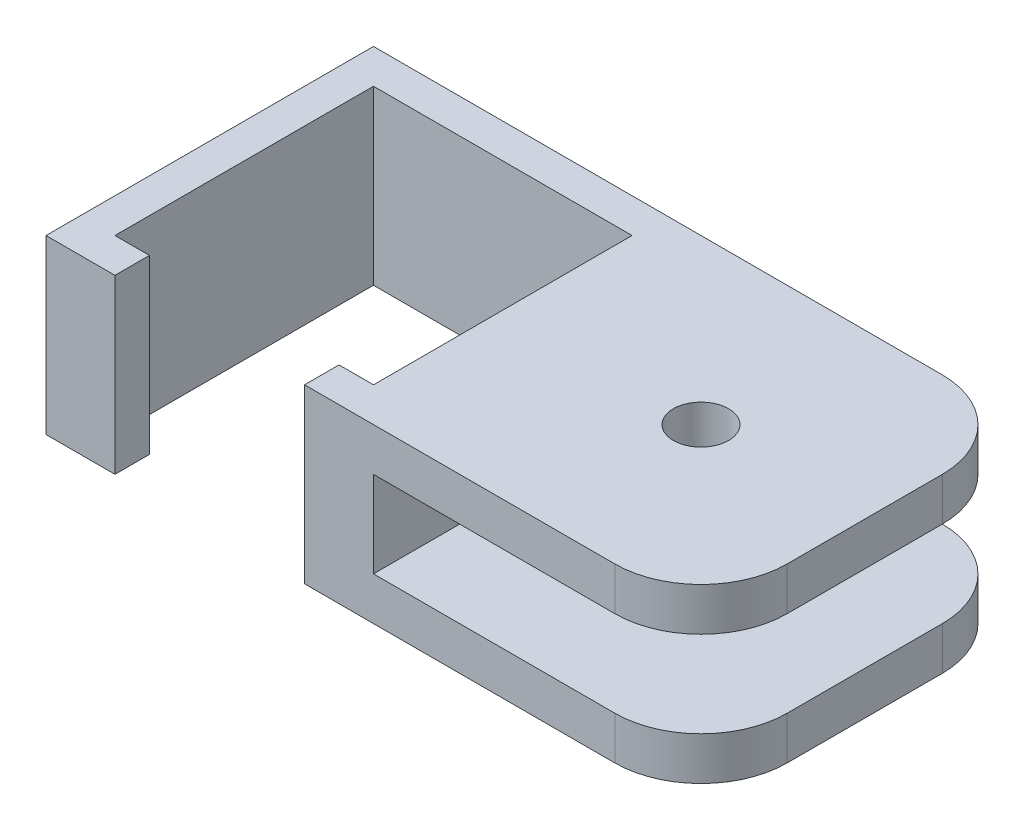
ISO-10303-21;
HEADER;
FILE_DESCRIPTION(('STEP AP214'),'2;1');
FILE_NAME('part.step','',(''),(''),'','','');
FILE_SCHEMA(('AUTOMOTIVE_DESIGN { 1 0 10303 214 1 1 1 1 }'));
ENDSEC;
DATA;
#1=APPLICATION_CONTEXT('core data for automotive mechanical design processes');
#2=APPLICATION_PROTOCOL_DEFINITION('international standard','automotive_design',2000,#1);
#3=PRODUCT_CONTEXT('',#1,'mechanical');
#4=PRODUCT('Part','Part','',(#3));
#5=PRODUCT_RELATED_PRODUCT_CATEGORY('part','',(#4));
#6=PRODUCT_DEFINITION_FORMATION('','',#4);
#7=PRODUCT_DEFINITION_CONTEXT('part definition',#1,'design');
#8=PRODUCT_DEFINITION('design','',#6,#7);
#9=PRODUCT_DEFINITION_SHAPE('','',#8);
#10=(LENGTH_UNIT() NAMED_UNIT(*) SI_UNIT(.MILLI.,.METRE.));
#11=(NAMED_UNIT(*) PLANE_ANGLE_UNIT() SI_UNIT($,.RADIAN.));
#12=(NAMED_UNIT(*) SI_UNIT($,.STERADIAN.) SOLID_ANGLE_UNIT());
#13=UNCERTAINTY_MEASURE_WITH_UNIT(LENGTH_MEASURE(1.E-05),#10,'distance_accuracy_value','');
#14=(GEOMETRIC_REPRESENTATION_CONTEXT(3) GLOBAL_UNCERTAINTY_ASSIGNED_CONTEXT((#13)) GLOBAL_UNIT_ASSIGNED_CONTEXT((#10,
#11,#12)) REPRESENTATION_CONTEXT('',''));
#15=CARTESIAN_POINT('',(0.,0.,0.));
#16=DIRECTION('',(0.,0.,1.));
#17=DIRECTION('',(1.,0.,0.));
#18=AXIS2_PLACEMENT_3D('',#15,#16,#17);
#19=CARTESIAN_POINT('',(28.5955882352941,0.,0.));
#20=DIRECTION('',(-1.,0.,0.));
#21=DIRECTION('',(0.,0.,1.));
#22=AXIS2_PLACEMENT_3D('',#19,#20,#21);
#23=PLANE('',#22);
#24=DIRECTION('',(0.,0.,-1.));
#25=VECTOR('',#24,1.);
#26=CARTESIAN_POINT('',(28.5955882352941,2.5,-8.32720588235292));
#27=LINE('',#26,#25);
#28=CARTESIAN_POINT('',(28.5955882352941,2.5,5.67279411764708));
#29=VERTEX_POINT('',#28);
#30=CARTESIAN_POINT('',(28.5955882352941,2.5,-3.32720588235292));
#31=VERTEX_POINT('',#30);
#32=EDGE_CURVE('E202',#29,#31,#27,.T.);
#33=ORIENTED_EDGE('',*,*,#32,.F.);
#34=DIRECTION('',(0.,-1.,0.));
#35=VECTOR('',#34,1.);
#36=CARTESIAN_POINT('',(28.5955882352941,19.,5.67279411764708));
#37=LINE('',#36,#35);
#38=CARTESIAN_POINT('',(28.5955882352941,0.,5.67279411764705));
#39=VERTEX_POINT('',#38);
#40=EDGE_CURVE('E11',#39,#29,#37,.F.);
#41=ORIENTED_EDGE('',*,*,#40,.F.);
#42=DIRECTION('',(0.,0.,-1.));
#43=VECTOR('',#42,1.);
#44=CARTESIAN_POINT('',(28.5955882352941,0.,10.6727941176471));
#45=LINE('',#44,#43);
#46=CARTESIAN_POINT('',(28.5955882352941,0.,-3.32720588235288));
#47=VERTEX_POINT('',#46);
#48=EDGE_CURVE('E268',#39,#47,#45,.T.);
#49=ORIENTED_EDGE('',*,*,#48,.T.);
#50=DIRECTION('',(0.,-1.,0.));
#51=VECTOR('',#50,1.);
#52=CARTESIAN_POINT('',(28.5955882352941,19.,-3.32720588235292));
#53=LINE('',#52,#51);
#54=EDGE_CURVE('E48',#47,#31,#53,.F.);
#55=ORIENTED_EDGE('',*,*,#54,.T.);
#56=EDGE_LOOP('',(#33,#41,#49,#55));
#57=FACE_BOUND('',#56,.T.);
#58=ADVANCED_FACE('F38',(#57),#23,.F.);
#59=CARTESIAN_POINT('',(23.5955882352941,19.,-3.32720588235292));
#60=DIRECTION('',(0.,-1.,0.));
#61=DIRECTION('',(0.,0.,-1.));
#62=AXIS2_PLACEMENT_3D('',#59,#60,#61);
#63=CYLINDRICAL_SURFACE('',#62,5.);
#64=CARTESIAN_POINT('',(23.5955882352941,2.5,-3.32720588235292));
#65=DIRECTION('',(0.,1.,0.));
#66=DIRECTION('',(0.,0.,1.));
#67=AXIS2_PLACEMENT_3D('',#64,#65,#66);
#68=CIRCLE('',#67,5.);
#69=CARTESIAN_POINT('',(23.5955882352941,2.5,-8.32720588235292));
#70=VERTEX_POINT('',#69);
#71=EDGE_CURVE('E212',#31,#70,#68,.T.);
#72=ORIENTED_EDGE('',*,*,#71,.F.);
#73=ORIENTED_EDGE('',*,*,#54,.F.);
#74=CARTESIAN_POINT('',(23.5955882352941,0.,-3.32720588235292));
#75=DIRECTION('',(0.,1.,0.));
#76=DIRECTION('',(0.,0.,1.));
#77=AXIS2_PLACEMENT_3D('',#74,#75,#76);
#78=CIRCLE('',#77,5.);
#79=CARTESIAN_POINT('',(23.5955882352941,0.,-8.32720588235292));
#80=VERTEX_POINT('',#79);
#81=EDGE_CURVE('E232',#47,#80,#78,.T.);
#82=ORIENTED_EDGE('',*,*,#81,.T.);
#83=DIRECTION('',(0.,-1.,0.));
#84=VECTOR('',#83,1.);
#85=CARTESIAN_POINT('',(23.5955882352941,19.,-8.32720588235292));
#86=LINE('',#85,#84);
#87=EDGE_CURVE('E252',#70,#80,#86,.T.);
#88=ORIENTED_EDGE('',*,*,#87,.F.);
#89=EDGE_LOOP('',(#72,#73,#82,#88));
#90=FACE_BOUND('',#89,.T.);
#91=ADVANCED_FACE('F417',(#90),#63,.T.);
#92=CARTESIAN_POINT('',(23.5955882352941,19.,5.67279411764708));
#93=DIRECTION('',(0.,-1.,0.));
#94=DIRECTION('',(0.,0.,-1.));
#95=AXIS2_PLACEMENT_3D('',#92,#93,#94);
#96=CYLINDRICAL_SURFACE('',#95,5.);
#97=CARTESIAN_POINT('',(23.5955882352941,2.5,5.67279411764708));
#98=DIRECTION('',(0.,1.,0.));
#99=DIRECTION('',(0.,0.,1.));
#100=AXIS2_PLACEMENT_3D('',#97,#98,#99);
#101=CIRCLE('',#100,5.);
#102=CARTESIAN_POINT('',(23.5955882352941,2.5,10.6727941176471));
#103=VERTEX_POINT('',#102);
#104=EDGE_CURVE('E209',#103,#29,#101,.T.);
#105=ORIENTED_EDGE('',*,*,#104,.F.);
#106=DIRECTION('',(0.,-1.,0.));
#107=VECTOR('',#106,1.);
#108=CARTESIAN_POINT('',(23.5955882352941,19.,10.6727941176471));
#109=LINE('',#108,#107);
#110=CARTESIAN_POINT('',(23.5955882352941,0.,10.6727941176471));
#111=VERTEX_POINT('',#110);
#112=EDGE_CURVE('E200',#103,#111,#109,.T.);
#113=ORIENTED_EDGE('',*,*,#112,.T.);
#114=CARTESIAN_POINT('',(23.5955882352941,0.,5.67279411764708));
#115=DIRECTION('',(0.,1.,0.));
#116=DIRECTION('',(0.,0.,1.));
#117=AXIS2_PLACEMENT_3D('',#114,#115,#116);
#118=CIRCLE('',#117,5.);
#119=EDGE_CURVE('E239',#111,#39,#118,.T.);
#120=ORIENTED_EDGE('',*,*,#119,.T.);
#121=ORIENTED_EDGE('',*,*,#40,.T.);
#122=EDGE_LOOP('',(#105,#113,#120,#121));
#123=FACE_BOUND('',#122,.T.);
#124=ADVANCED_FACE('F411',(#123),#96,.T.);
#125=CARTESIAN_POINT('',(19.0955882352941,19.,1.17279411764708));
#126=DIRECTION('',(0.,-1.,0.));
#127=DIRECTION('',(0.,0.,-1.));
#128=AXIS2_PLACEMENT_3D('',#125,#126,#127);
#129=CYLINDRICAL_SURFACE('',#128,1.6);
#130=CARTESIAN_POINT('',(19.0955882352941,0.,1.17279411764708));
#131=DIRECTION('',(0.,-1.,0.));
#132=DIRECTION('',(0.,0.,-1.));
#133=AXIS2_PLACEMENT_3D('',#130,#131,#132);
#134=CIRCLE('',#133,1.6);
#135=CARTESIAN_POINT('',(19.0955882352941,0.,-0.427205882352919));
#136=VERTEX_POINT('',#135);
#137=EDGE_CURVE('E233',#136,#136,#134,.T.);
#138=ORIENTED_EDGE('',*,*,#137,.T.);
#139=EDGE_LOOP('',(#138));
#140=FACE_BOUND('',#139,.T.);
#141=CARTESIAN_POINT('',(19.0955882352941,2.5,1.17279411764708));
#142=DIRECTION('',(0.,1.,0.));
#143=DIRECTION('',(0.,0.,1.));
#144=AXIS2_PLACEMENT_3D('',#141,#142,#143);
#145=CIRCLE('',#144,1.6);
#146=CARTESIAN_POINT('',(19.0955882352941,2.5,2.77279411764708));
#147=VERTEX_POINT('',#146);
#148=EDGE_CURVE('E42',#147,#147,#145,.F.);
#149=ORIENTED_EDGE('',*,*,#148,.F.);
#150=EDGE_LOOP('',(#149));
#151=FACE_BOUND('',#150,.T.);
#152=ADVANCED_FACE('F400',(#140,#151),#129,.F.);
#153=CARTESIAN_POINT('',(28.5955882352941,0.,0.));
#154=DIRECTION('',(1.,0.,0.));
#155=DIRECTION('',(0.,0.,-1.));
#156=AXIS2_PLACEMENT_3D('',#153,#154,#155);
#157=PLANE('',#156);
#158=DIRECTION('',(0.,-1.,0.));
#159=VECTOR('',#158,1.);
#160=CARTESIAN_POINT('',(28.5955882352941,19.,5.67279411764705));
#161=LINE('',#160,#159);
#162=CARTESIAN_POINT('',(28.5955882352941,10.,5.67279411764705));
#163=VERTEX_POINT('',#162);
#164=CARTESIAN_POINT('',(28.5955882352941,7.5,5.67279411764705));
#165=VERTEX_POINT('',#164);
#166=EDGE_CURVE('E242',#163,#165,#161,.T.);
#167=ORIENTED_EDGE('',*,*,#166,.T.);
#168=DIRECTION('',(0.,0.,1.));
#169=VECTOR('',#168,1.);
#170=CARTESIAN_POINT('',(28.5955882352941,7.5,10.6727941176471));
#171=LINE('',#170,#169);
#172=CARTESIAN_POINT('',(28.5955882352941,7.5,-3.32720588235292));
#173=VERTEX_POINT('',#172);
#174=EDGE_CURVE('E64',#173,#165,#171,.T.);
#175=ORIENTED_EDGE('',*,*,#174,.F.);
#176=DIRECTION('',(0.,-1.,0.));
#177=VECTOR('',#176,1.);
#178=CARTESIAN_POINT('',(28.5955882352941,19.,-3.32720588235288));
#179=LINE('',#178,#177);
#180=CARTESIAN_POINT('',(28.5955882352941,10.,-3.32720588235292));
#181=VERTEX_POINT('',#180);
#182=EDGE_CURVE('E243',#181,#173,#179,.T.);
#183=ORIENTED_EDGE('',*,*,#182,.F.);
#184=DIRECTION('',(0.,0.,1.));
#185=VECTOR('',#184,1.);
#186=CARTESIAN_POINT('',(28.5955882352941,10.,10.6727941176471));
#187=LINE('',#186,#185);
#188=EDGE_CURVE('E272',#181,#163,#187,.T.);
#189=ORIENTED_EDGE('',*,*,#188,.T.);
#190=EDGE_LOOP('',(#167,#175,#183,#189));
#191=FACE_BOUND('',#190,.T.);
#192=ADVANCED_FACE('F414',(#191),#157,.T.);
#193=CARTESIAN_POINT('',(23.5955882352941,7.5,-3.32720588235292));
#194=DIRECTION('',(0.,-1.,0.));
#195=DIRECTION('',(0.,0.,-1.));
#196=AXIS2_PLACEMENT_3D('',#193,#194,#195);
#197=CIRCLE('',#196,5.);
#198=CARTESIAN_POINT('',(23.5955882352941,7.5,-8.32720588235292));
#199=VERTEX_POINT('',#198);
#200=EDGE_CURVE('E229',#199,#173,#197,.T.);
#201=ORIENTED_EDGE('',*,*,#200,.F.);
#202=CARTESIAN_POINT('',(23.5955882352941,10.,-8.32720588235292));
#203=VERTEX_POINT('',#202);
#204=EDGE_CURVE('E256',#203,#199,#86,.T.);
#205=ORIENTED_EDGE('',*,*,#204,.F.);
#206=CARTESIAN_POINT('',(23.5955882352941,10.,-3.32720588235292));
#207=DIRECTION('',(0.,1.,0.));
#208=DIRECTION('',(0.,0.,1.));
#209=AXIS2_PLACEMENT_3D('',#206,#207,#208);
#210=CIRCLE('',#209,5.);
#211=EDGE_CURVE('E237',#203,#181,#210,.F.);
#212=ORIENTED_EDGE('',*,*,#211,.T.);
#213=ORIENTED_EDGE('',*,*,#182,.T.);
#214=EDGE_LOOP('',(#201,#205,#212,#213));
#215=FACE_BOUND('',#214,.T.);
#216=ADVANCED_FACE('F408',(#215),#63,.T.);
#217=CARTESIAN_POINT('',(23.5955882352941,7.5,5.67279411764708));
#218=DIRECTION('',(0.,-1.,0.));
#219=DIRECTION('',(0.,0.,-1.));
#220=AXIS2_PLACEMENT_3D('',#217,#218,#219);
#221=CIRCLE('',#220,5.);
#222=CARTESIAN_POINT('',(23.5955882352941,7.5,10.6727941176471));
#223=VERTEX_POINT('',#222);
#224=EDGE_CURVE('E226',#165,#223,#221,.T.);
#225=ORIENTED_EDGE('',*,*,#224,.F.);
#226=ORIENTED_EDGE('',*,*,#166,.F.);
#227=CARTESIAN_POINT('',(23.5955882352941,10.,5.67279411764708));
#228=DIRECTION('',(0.,1.,0.));
#229=DIRECTION('',(0.,0.,1.));
#230=AXIS2_PLACEMENT_3D('',#227,#228,#229);
#231=CIRCLE('',#230,5.);
#232=CARTESIAN_POINT('',(23.5955882352941,10.,10.6727941176471));
#233=VERTEX_POINT('',#232);
#234=EDGE_CURVE('E261',#163,#233,#231,.F.);
#235=ORIENTED_EDGE('',*,*,#234,.T.);
#236=EDGE_CURVE('E238',#233,#223,#109,.T.);
#237=ORIENTED_EDGE('',*,*,#236,.T.);
#238=EDGE_LOOP('',(#225,#226,#235,#237));
#239=FACE_BOUND('',#238,.T.);
#240=ADVANCED_FACE('F397',(#239),#96,.T.);
#241=CARTESIAN_POINT('',(19.0955882352941,10.,1.17279411764708));
#242=DIRECTION('',(0.,1.,0.));
#243=DIRECTION('',(0.,0.,1.));
#244=AXIS2_PLACEMENT_3D('',#241,#242,#243);
#245=CIRCLE('',#244,1.6);
#246=CARTESIAN_POINT('',(19.0955882352941,10.,2.77279411764708));
#247=VERTEX_POINT('',#246);
#248=EDGE_CURVE('E264',#247,#247,#245,.T.);
#249=ORIENTED_EDGE('',*,*,#248,.T.);
#250=EDGE_LOOP('',(#249));
#251=FACE_BOUND('',#250,.T.);
#252=CARTESIAN_POINT('',(19.0955882352941,7.5,1.17279411764708));
#253=DIRECTION('',(0.,-1.,0.));
#254=DIRECTION('',(0.,0.,-1.));
#255=AXIS2_PLACEMENT_3D('',#252,#253,#254);
#256=CIRCLE('',#255,1.6);
#257=CARTESIAN_POINT('',(19.0955882352941,7.5,-0.427205882352919));
#258=VERTEX_POINT('',#257);
#259=EDGE_CURVE('E225',#258,#258,#256,.F.);
#260=ORIENTED_EDGE('',*,*,#259,.F.);
#261=EDGE_LOOP('',(#260));
#262=FACE_BOUND('',#261,.T.);
#263=ADVANCED_FACE('F394',(#251,#262),#129,.F.);
#264=CARTESIAN_POINT('',(-9.40441176470588,10.,-8.32720588235292));
#265=DIRECTION('',(0.,0.,1.));
#266=DIRECTION('',(1.,0.,0.));
#267=AXIS2_PLACEMENT_3D('',#264,#265,#266);
#268=PLANE('',#267);
#269=DIRECTION('',(0.,-1.,0.));
#270=VECTOR('',#269,1.);
#271=CARTESIAN_POINT('',(9.59558823529411,10.,-8.32720588235292));
#272=LINE('',#271,#270);
#273=CARTESIAN_POINT('',(9.59558823529412,7.5,-8.32720588235292));
#274=VERTEX_POINT('',#273);
#275=CARTESIAN_POINT('',(9.59558823529411,2.5,-8.32720588235292));
#276=VERTEX_POINT('',#275);
#277=EDGE_CURVE('E189',#274,#276,#272,.T.);
#278=ORIENTED_EDGE('',*,*,#277,.T.);
#279=DIRECTION('',(-1.,0.,0.));
#280=VECTOR('',#279,1.);
#281=CARTESIAN_POINT('',(9.59558823529411,2.5,-8.32720588235292));
#282=LINE('',#281,#280);
#283=EDGE_CURVE('E194',#70,#276,#282,.T.);
#284=ORIENTED_EDGE('',*,*,#283,.F.);
#285=ORIENTED_EDGE('',*,*,#87,.T.);
#286=DIRECTION('',(-1.,0.,0.));
#287=VECTOR('',#286,1.);
#288=CARTESIAN_POINT('',(-9.40441176470588,0.,-8.32720588235292));
#289=LINE('',#288,#287);
#290=CARTESIAN_POINT('',(-9.40441176470588,0.,-8.32720588235292));
#291=VERTEX_POINT('',#290);
#292=EDGE_CURVE('E332',#80,#291,#289,.T.);
#293=ORIENTED_EDGE('',*,*,#292,.T.);
#294=DIRECTION('',(0.,-1.,0.));
#295=VECTOR('',#294,1.);
#296=CARTESIAN_POINT('',(-9.40441176470588,10.,-8.32720588235292));
#297=LINE('',#296,#295);
#298=CARTESIAN_POINT('',(-9.40441176470588,10.,-8.32720588235292));
#299=VERTEX_POINT('',#298);
#300=EDGE_CURVE('E361',#299,#291,#297,.T.);
#301=ORIENTED_EDGE('',*,*,#300,.F.);
#302=DIRECTION('',(-1.,0.,0.));
#303=VECTOR('',#302,1.);
#304=CARTESIAN_POINT('',(-9.40441176470588,10.,-8.32720588235292));
#305=LINE('',#304,#303);
#306=EDGE_CURVE('E298',#203,#299,#305,.T.);
#307=ORIENTED_EDGE('',*,*,#306,.F.);
#308=ORIENTED_EDGE('',*,*,#204,.T.);
#309=DIRECTION('',(1.,0.,0.));
#310=VECTOR('',#309,1.);
#311=CARTESIAN_POINT('',(9.59558823529412,7.5,-8.32720588235292));
#312=LINE('',#311,#310);
#313=EDGE_CURVE('E217',#274,#199,#312,.T.);
#314=ORIENTED_EDGE('',*,*,#313,.F.);
#315=EDGE_LOOP('',(#278,#284,#285,#293,#301,#307,#308,#314));
#316=FACE_BOUND('',#315,.T.);
#317=ADVANCED_FACE('F396',(#316),#268,.F.);
#318=CARTESIAN_POINT('',(9.59558823529411,10.,-8.32720588235292));
#319=DIRECTION('',(-1.,0.,0.));
#320=DIRECTION('',(0.,0.,1.));
#321=AXIS2_PLACEMENT_3D('',#318,#319,#320);
#322=PLANE('',#321);
#323=DIRECTION('',(0.,-1.,0.));
#324=VECTOR('',#323,1.);
#325=CARTESIAN_POINT('',(9.59558823529412,10.,10.6727941176471));
#326=LINE('',#325,#324);
#327=CARTESIAN_POINT('',(9.59558823529412,7.5,10.6727941176471));
#328=VERTEX_POINT('',#327);
#329=CARTESIAN_POINT('',(9.59558823529412,2.5,10.6727941176471));
#330=VERTEX_POINT('',#329);
#331=EDGE_CURVE('E179',#328,#330,#326,.T.);
#332=ORIENTED_EDGE('',*,*,#331,.T.);
#333=DIRECTION('',(0.,0.,1.));
#334=VECTOR('',#333,1.);
#335=CARTESIAN_POINT('',(9.59558823529411,2.5,-8.32720588235292));
#336=LINE('',#335,#334);
#337=EDGE_CURVE('E181',#276,#330,#336,.T.);
#338=ORIENTED_EDGE('',*,*,#337,.F.);
#339=ORIENTED_EDGE('',*,*,#277,.F.);
#340=DIRECTION('',(0.,0.,-1.));
#341=VECTOR('',#340,1.);
#342=CARTESIAN_POINT('',(9.59558823529412,7.5,10.6727941176471));
#343=LINE('',#342,#341);
#344=EDGE_CURVE('E183',#328,#274,#343,.T.);
#345=ORIENTED_EDGE('',*,*,#344,.F.);
#346=EDGE_LOOP('',(#332,#338,#339,#345));
#347=FACE_BOUND('',#346,.T.);
#348=ADVANCED_FACE('F180',(#347),#322,.F.);
#349=CARTESIAN_POINT('',(-7.40441176470588,10.,-6.32720588235292));
#350=DIRECTION('',(-1.,0.,0.));
#351=DIRECTION('',(0.,0.,1.));
#352=AXIS2_PLACEMENT_3D('',#349,#350,#351);
#353=PLANE('',#352);
#354=DIRECTION('',(0.,0.,-1.));
#355=VECTOR('',#354,1.);
#356=CARTESIAN_POINT('',(-7.40441176470588,0.,-6.32720588235292));
#357=LINE('',#356,#355);
#358=CARTESIAN_POINT('',(-7.40441176470588,0.,8.67279411764708));
#359=VERTEX_POINT('',#358);
#360=CARTESIAN_POINT('',(-7.40441176470588,0.,-6.32720588235292));
#361=VERTEX_POINT('',#360);
#362=EDGE_CURVE('E276',#359,#361,#357,.T.);
#363=ORIENTED_EDGE('',*,*,#362,.T.);
#364=DIRECTION('',(0.,-1.,0.));
#365=VECTOR('',#364,1.);
#366=CARTESIAN_POINT('',(-7.40441176470588,10.,-6.32720588235292));
#367=LINE('',#366,#365);
#368=CARTESIAN_POINT('',(-7.40441176470588,10.,-6.32720588235292));
#369=VERTEX_POINT('',#368);
#370=EDGE_CURVE('E382',#369,#361,#367,.T.);
#371=ORIENTED_EDGE('',*,*,#370,.F.);
#372=DIRECTION('',(0.,0.,-1.));
#373=VECTOR('',#372,1.);
#374=CARTESIAN_POINT('',(-7.40441176470588,10.,-6.32720588235292));
#375=LINE('',#374,#373);
#376=CARTESIAN_POINT('',(-7.40441176470588,10.,8.67279411764708));
#377=VERTEX_POINT('',#376);
#378=EDGE_CURVE('E277',#377,#369,#375,.T.);
#379=ORIENTED_EDGE('',*,*,#378,.F.);
#380=DIRECTION('',(0.,-1.,0.));
#381=VECTOR('',#380,1.);
#382=CARTESIAN_POINT('',(-7.40441176470588,10.,8.67279411764708));
#383=LINE('',#382,#381);
#384=EDGE_CURVE('E313',#377,#359,#383,.T.);
#385=ORIENTED_EDGE('',*,*,#384,.T.);
#386=EDGE_LOOP('',(#363,#371,#379,#385));
#387=FACE_BOUND('',#386,.T.);
#388=ADVANCED_FACE('F40',(#387),#353,.F.);
#389=CARTESIAN_POINT('',(-7.40441176470588,10.,-6.32720588235292));
#390=DIRECTION('',(0.,0.,-1.));
#391=DIRECTION('',(-1.,0.,0.));
#392=AXIS2_PLACEMENT_3D('',#389,#390,#391);
#393=PLANE('',#392);
#394=DIRECTION('',(1.,0.,0.));
#395=VECTOR('',#394,1.);
#396=CARTESIAN_POINT('',(-7.40441176470588,0.,-6.32720588235292));
#397=LINE('',#396,#395);
#398=CARTESIAN_POINT('',(7.59558823529412,0.,-6.32720588235291));
#399=VERTEX_POINT('',#398);
#400=EDGE_CURVE('E317',#361,#399,#397,.T.);
#401=ORIENTED_EDGE('',*,*,#400,.T.);
#402=DIRECTION('',(0.,-1.,0.));
#403=VECTOR('',#402,1.);
#404=CARTESIAN_POINT('',(7.59558823529412,10.,-6.32720588235291));
#405=LINE('',#404,#403);
#406=CARTESIAN_POINT('',(7.59558823529412,10.,-6.32720588235291));
#407=VERTEX_POINT('',#406);
#408=EDGE_CURVE('E378',#407,#399,#405,.T.);
#409=ORIENTED_EDGE('',*,*,#408,.F.);
#410=DIRECTION('',(1.,0.,0.));
#411=VECTOR('',#410,1.);
#412=CARTESIAN_POINT('',(-7.40441176470588,10.,-6.32720588235292));
#413=LINE('',#412,#411);
#414=EDGE_CURVE('E281',#369,#407,#413,.T.);
#415=ORIENTED_EDGE('',*,*,#414,.F.);
#416=ORIENTED_EDGE('',*,*,#370,.T.);
#417=EDGE_LOOP('',(#401,#409,#415,#416));
#418=FACE_BOUND('',#417,.T.);
#419=ADVANCED_FACE('F468',(#418),#393,.F.);
#420=CARTESIAN_POINT('',(7.59558823529412,10.,-6.32720588235291));
#421=DIRECTION('',(1.,0.,0.));
#422=DIRECTION('',(0.,0.,-1.));
#423=AXIS2_PLACEMENT_3D('',#420,#421,#422);
#424=PLANE('',#423);
#425=DIRECTION('',(0.,0.,1.));
#426=VECTOR('',#425,1.);
#427=CARTESIAN_POINT('',(7.59558823529412,0.,-6.32720588235291));
#428=LINE('',#427,#426);
#429=CARTESIAN_POINT('',(7.59558823529412,0.,8.67279411764708));
#430=VERTEX_POINT('',#429);
#431=EDGE_CURVE('E320',#399,#430,#428,.T.);
#432=ORIENTED_EDGE('',*,*,#431,.T.);
#433=DIRECTION('',(0.,-1.,0.));
#434=VECTOR('',#433,1.);
#435=CARTESIAN_POINT('',(7.59558823529412,10.,8.67279411764708));
#436=LINE('',#435,#434);
#437=CARTESIAN_POINT('',(7.59558823529412,10.,8.67279411764708));
#438=VERTEX_POINT('',#437);
#439=EDGE_CURVE('E374',#438,#430,#436,.T.);
#440=ORIENTED_EDGE('',*,*,#439,.F.);
#441=DIRECTION('',(0.,0.,1.));
#442=VECTOR('',#441,1.);
#443=CARTESIAN_POINT('',(7.59558823529412,10.,-6.32720588235291));
#444=LINE('',#443,#442);
#445=EDGE_CURVE('E285',#407,#438,#444,.T.);
#446=ORIENTED_EDGE('',*,*,#445,.F.);
#447=ORIENTED_EDGE('',*,*,#408,.T.);
#448=EDGE_LOOP('',(#432,#440,#446,#447));
#449=FACE_BOUND('',#448,.T.);
#450=ADVANCED_FACE('F465',(#449),#424,.F.);
#451=CARTESIAN_POINT('',(5.59558823529412,10.,8.67279411764708));
#452=DIRECTION('',(0.,0.,1.));
#453=DIRECTION('',(1.,0.,0.));
#454=AXIS2_PLACEMENT_3D('',#451,#452,#453);
#455=PLANE('',#454);
#456=DIRECTION('',(-1.,0.,0.));
#457=VECTOR('',#456,1.);
#458=CARTESIAN_POINT('',(5.59558823529412,0.,8.67279411764708));
#459=LINE('',#458,#457);
#460=CARTESIAN_POINT('',(5.59558823529412,0.,8.67279411764708));
#461=VERTEX_POINT('',#460);
#462=EDGE_CURVE('E323',#430,#461,#459,.T.);
#463=ORIENTED_EDGE('',*,*,#462,.T.);
#464=DIRECTION('',(0.,-1.,0.));
#465=VECTOR('',#464,1.);
#466=CARTESIAN_POINT('',(5.59558823529412,10.,8.67279411764708));
#467=LINE('',#466,#465);
#468=CARTESIAN_POINT('',(5.59558823529412,10.,8.67279411764708));
#469=VERTEX_POINT('',#468);
#470=EDGE_CURVE('E370',#469,#461,#467,.T.);
#471=ORIENTED_EDGE('',*,*,#470,.F.);
#472=DIRECTION('',(-1.,0.,0.));
#473=VECTOR('',#472,1.);
#474=CARTESIAN_POINT('',(5.59558823529412,10.,8.67279411764708));
#475=LINE('',#474,#473);
#476=EDGE_CURVE('E288',#438,#469,#475,.T.);
#477=ORIENTED_EDGE('',*,*,#476,.F.);
#478=ORIENTED_EDGE('',*,*,#439,.T.);
#479=EDGE_LOOP('',(#463,#471,#477,#478));
#480=FACE_BOUND('',#479,.T.);
#481=ADVANCED_FACE('F461',(#480),#455,.F.);
#482=CARTESIAN_POINT('',(5.59558823529412,10.,10.6727941176471));
#483=DIRECTION('',(1.,0.,0.));
#484=DIRECTION('',(0.,0.,-1.));
#485=AXIS2_PLACEMENT_3D('',#482,#483,#484);
#486=PLANE('',#485);
#487=DIRECTION('',(0.,0.,1.));
#488=VECTOR('',#487,1.);
#489=CARTESIAN_POINT('',(5.59558823529412,0.,10.6727941176471));
#490=LINE('',#489,#488);
#491=CARTESIAN_POINT('',(5.59558823529412,0.,10.6727941176471));
#492=VERTEX_POINT('',#491);
#493=EDGE_CURVE('E326',#461,#492,#490,.T.);
#494=ORIENTED_EDGE('',*,*,#493,.T.);
#495=DIRECTION('',(0.,-1.,0.));
#496=VECTOR('',#495,1.);
#497=CARTESIAN_POINT('',(5.59558823529412,10.,10.6727941176471));
#498=LINE('',#497,#496);
#499=CARTESIAN_POINT('',(5.59558823529412,10.,10.6727941176471));
#500=VERTEX_POINT('',#499);
#501=EDGE_CURVE('E188',#500,#492,#498,.T.);
#502=ORIENTED_EDGE('',*,*,#501,.F.);
#503=DIRECTION('',(0.,0.,1.));
#504=VECTOR('',#503,1.);
#505=CARTESIAN_POINT('',(5.59558823529412,10.,10.6727941176471));
#506=LINE('',#505,#504);
#507=EDGE_CURVE('E291',#469,#500,#506,.T.);
#508=ORIENTED_EDGE('',*,*,#507,.F.);
#509=ORIENTED_EDGE('',*,*,#470,.T.);
#510=EDGE_LOOP('',(#494,#502,#508,#509));
#511=FACE_BOUND('',#510,.T.);
#512=ADVANCED_FACE('F458',(#511),#486,.F.);
#513=CARTESIAN_POINT('',(9.59558823529412,10.,10.6727941176471));
#514=DIRECTION('',(0.,0.,-1.));
#515=DIRECTION('',(-1.,0.,0.));
#516=AXIS2_PLACEMENT_3D('',#513,#514,#515);
#517=PLANE('',#516);
#518=DIRECTION('',(1.,0.,0.));
#519=VECTOR('',#518,1.);
#520=CARTESIAN_POINT('',(9.59558823529412,2.5,10.6727941176471));
#521=LINE('',#520,#519);
#522=EDGE_CURVE('E56',#330,#103,#521,.T.);
#523=ORIENTED_EDGE('',*,*,#522,.F.);
#524=ORIENTED_EDGE('',*,*,#331,.F.);
#525=DIRECTION('',(-1.,0.,0.));
#526=VECTOR('',#525,1.);
#527=CARTESIAN_POINT('',(9.59558823529412,7.5,10.6727941176471));
#528=LINE('',#527,#526);
#529=EDGE_CURVE('E222',#223,#328,#528,.T.);
#530=ORIENTED_EDGE('',*,*,#529,.F.);
#531=ORIENTED_EDGE('',*,*,#236,.F.);
#532=DIRECTION('',(1.,0.,0.));
#533=VECTOR('',#532,1.);
#534=CARTESIAN_POINT('',(9.59558823529412,10.,10.6727941176471));
#535=LINE('',#534,#533);
#536=EDGE_CURVE('E294',#500,#233,#535,.T.);
#537=ORIENTED_EDGE('',*,*,#536,.F.);
#538=ORIENTED_EDGE('',*,*,#501,.T.);
#539=DIRECTION('',(1.,0.,0.));
#540=VECTOR('',#539,1.);
#541=CARTESIAN_POINT('',(9.59558823529412,0.,10.6727941176471));
#542=LINE('',#541,#540);
#543=EDGE_CURVE('E329',#492,#111,#542,.T.);
#544=ORIENTED_EDGE('',*,*,#543,.T.);
#545=ORIENTED_EDGE('',*,*,#112,.F.);
#546=EDGE_LOOP('',(#523,#524,#530,#531,#537,#538,#544,#545));
#547=FACE_BOUND('',#546,.T.);
#548=ADVANCED_FACE('F198',(#547),#517,.F.);
#549=CARTESIAN_POINT('',(-9.40441176470588,10.,10.6727941176471));
#550=DIRECTION('',(1.,0.,0.));
#551=DIRECTION('',(0.,0.,-1.));
#552=AXIS2_PLACEMENT_3D('',#549,#550,#551);
#553=PLANE('',#552);
#554=DIRECTION('',(0.,0.,1.));
#555=VECTOR('',#554,1.);
#556=CARTESIAN_POINT('',(-9.40441176470588,0.,10.6727941176471));
#557=LINE('',#556,#555);
#558=CARTESIAN_POINT('',(-9.40441176470588,0.,10.6727941176471));
#559=VERTEX_POINT('',#558);
#560=EDGE_CURVE('E335',#291,#559,#557,.T.);
#561=ORIENTED_EDGE('',*,*,#560,.T.);
#562=DIRECTION('',(0.,-1.,0.));
#563=VECTOR('',#562,1.);
#564=CARTESIAN_POINT('',(-9.40441176470588,10.,10.6727941176471));
#565=LINE('',#564,#563);
#566=CARTESIAN_POINT('',(-9.40441176470588,10.,10.6727941176471));
#567=VERTEX_POINT('',#566);
#568=EDGE_CURVE('E357',#567,#559,#565,.T.);
#569=ORIENTED_EDGE('',*,*,#568,.F.);
#570=DIRECTION('',(0.,0.,1.));
#571=VECTOR('',#570,1.);
#572=CARTESIAN_POINT('',(-9.40441176470588,10.,10.6727941176471));
#573=LINE('',#572,#571);
#574=EDGE_CURVE('E301',#299,#567,#573,.T.);
#575=ORIENTED_EDGE('',*,*,#574,.F.);
#576=ORIENTED_EDGE('',*,*,#300,.T.);
#577=EDGE_LOOP('',(#561,#569,#575,#576));
#578=FACE_BOUND('',#577,.T.);
#579=ADVANCED_FACE('F449',(#578),#553,.F.);
#580=CARTESIAN_POINT('',(-5.40441176470588,10.,10.6727941176471));
#581=DIRECTION('',(0.,0.,-1.));
#582=DIRECTION('',(-1.,0.,0.));
#583=AXIS2_PLACEMENT_3D('',#580,#581,#582);
#584=PLANE('',#583);
#585=DIRECTION('',(1.,0.,0.));
#586=VECTOR('',#585,1.);
#587=CARTESIAN_POINT('',(-5.40441176470588,0.,10.6727941176471));
#588=LINE('',#587,#586);
#589=CARTESIAN_POINT('',(-5.40441176470588,0.,10.6727941176471));
#590=VERTEX_POINT('',#589);
#591=EDGE_CURVE('E338',#559,#590,#588,.T.);
#592=ORIENTED_EDGE('',*,*,#591,.T.);
#593=DIRECTION('',(0.,-1.,0.));
#594=VECTOR('',#593,1.);
#595=CARTESIAN_POINT('',(-5.40441176470588,10.,10.6727941176471));
#596=LINE('',#595,#594);
#597=CARTESIAN_POINT('',(-5.40441176470588,10.,10.6727941176471));
#598=VERTEX_POINT('',#597);
#599=EDGE_CURVE('E353',#598,#590,#596,.T.);
#600=ORIENTED_EDGE('',*,*,#599,.F.);
#601=DIRECTION('',(1.,0.,0.));
#602=VECTOR('',#601,1.);
#603=CARTESIAN_POINT('',(-5.40441176470588,10.,10.6727941176471));
#604=LINE('',#603,#602);
#605=EDGE_CURVE('E304',#567,#598,#604,.T.);
#606=ORIENTED_EDGE('',*,*,#605,.F.);
#607=ORIENTED_EDGE('',*,*,#568,.T.);
#608=EDGE_LOOP('',(#592,#600,#606,#607));
#609=FACE_BOUND('',#608,.T.);
#610=ADVANCED_FACE('F445',(#609),#584,.F.);
#611=CARTESIAN_POINT('',(-5.40441176470588,10.,8.67279411764708));
#612=DIRECTION('',(-1.,0.,0.));
#613=DIRECTION('',(0.,0.,1.));
#614=AXIS2_PLACEMENT_3D('',#611,#612,#613);
#615=PLANE('',#614);
#616=DIRECTION('',(0.,0.,-1.));
#617=VECTOR('',#616,1.);
#618=CARTESIAN_POINT('',(-5.40441176470588,0.,8.67279411764708));
#619=LINE('',#618,#617);
#620=CARTESIAN_POINT('',(-5.40441176470588,0.,8.67279411764708));
#621=VERTEX_POINT('',#620);
#622=EDGE_CURVE('E341',#590,#621,#619,.T.);
#623=ORIENTED_EDGE('',*,*,#622,.T.);
#624=DIRECTION('',(0.,-1.,0.));
#625=VECTOR('',#624,1.);
#626=CARTESIAN_POINT('',(-5.40441176470588,10.,8.67279411764708));
#627=LINE('',#626,#625);
#628=CARTESIAN_POINT('',(-5.40441176470588,10.,8.67279411764708));
#629=VERTEX_POINT('',#628);
#630=EDGE_CURVE('E349',#629,#621,#627,.T.);
#631=ORIENTED_EDGE('',*,*,#630,.F.);
#632=DIRECTION('',(0.,0.,-1.));
#633=VECTOR('',#632,1.);
#634=CARTESIAN_POINT('',(-5.40441176470588,10.,8.67279411764708));
#635=LINE('',#634,#633);
#636=EDGE_CURVE('E307',#598,#629,#635,.T.);
#637=ORIENTED_EDGE('',*,*,#636,.F.);
#638=ORIENTED_EDGE('',*,*,#599,.T.);
#639=EDGE_LOOP('',(#623,#631,#637,#638));
#640=FACE_BOUND('',#639,.T.);
#641=ADVANCED_FACE('F441',(#640),#615,.F.);
#642=CARTESIAN_POINT('',(-7.40441176470588,10.,8.67279411764708));
#643=DIRECTION('',(0.,0.,1.));
#644=DIRECTION('',(1.,0.,0.));
#645=AXIS2_PLACEMENT_3D('',#642,#643,#644);
#646=PLANE('',#645);
#647=DIRECTION('',(-1.,0.,0.));
#648=VECTOR('',#647,1.);
#649=CARTESIAN_POINT('',(-7.40441176470588,0.,8.67279411764708));
#650=LINE('',#649,#648);
#651=EDGE_CURVE('E282',#621,#359,#650,.T.);
#652=ORIENTED_EDGE('',*,*,#651,.T.);
#653=ORIENTED_EDGE('',*,*,#384,.F.);
#654=DIRECTION('',(-1.,0.,0.));
#655=VECTOR('',#654,1.);
#656=CARTESIAN_POINT('',(-7.40441176470588,10.,8.67279411764708));
#657=LINE('',#656,#655);
#658=EDGE_CURVE('E310',#629,#377,#657,.T.);
#659=ORIENTED_EDGE('',*,*,#658,.F.);
#660=ORIENTED_EDGE('',*,*,#630,.T.);
#661=EDGE_LOOP('',(#652,#653,#659,#660));
#662=FACE_BOUND('',#661,.T.);
#663=ADVANCED_FACE('F434',(#662),#646,.F.);
#664=CARTESIAN_POINT('',(0.,10.,0.));
#665=DIRECTION('',(0.,1.,0.));
#666=DIRECTION('',(0.,0.,1.));
#667=AXIS2_PLACEMENT_3D('',#664,#665,#666);
#668=PLANE('',#667);
#669=ORIENTED_EDGE('',*,*,#248,.F.);
#670=EDGE_LOOP('',(#669));
#671=FACE_BOUND('',#670,.T.);
#672=ORIENTED_EDGE('',*,*,#234,.F.);
#673=ORIENTED_EDGE('',*,*,#188,.F.);
#674=ORIENTED_EDGE('',*,*,#211,.F.);
#675=ORIENTED_EDGE('',*,*,#306,.T.);
#676=ORIENTED_EDGE('',*,*,#574,.T.);
#677=ORIENTED_EDGE('',*,*,#605,.T.);
#678=ORIENTED_EDGE('',*,*,#636,.T.);
#679=ORIENTED_EDGE('',*,*,#658,.T.);
#680=ORIENTED_EDGE('',*,*,#378,.T.);
#681=ORIENTED_EDGE('',*,*,#414,.T.);
#682=ORIENTED_EDGE('',*,*,#445,.T.);
#683=ORIENTED_EDGE('',*,*,#476,.T.);
#684=ORIENTED_EDGE('',*,*,#507,.T.);
#685=ORIENTED_EDGE('',*,*,#536,.T.);
#686=EDGE_LOOP('',(#672,#673,#674,#675,#676,#677,#678,#679,#680,#681,#682,#683,#684,#685));
#687=FACE_BOUND('',#686,.T.);
#688=ADVANCED_FACE('F430',(#671,#687),#668,.T.);
#689=CARTESIAN_POINT('',(0.,0.,0.));
#690=DIRECTION('',(0.,1.,0.));
#691=DIRECTION('',(0.,0.,1.));
#692=AXIS2_PLACEMENT_3D('',#689,#690,#691);
#693=PLANE('',#692);
#694=ORIENTED_EDGE('',*,*,#137,.F.);
#695=EDGE_LOOP('',(#694));
#696=FACE_BOUND('',#695,.T.);
#697=ORIENTED_EDGE('',*,*,#48,.F.);
#698=ORIENTED_EDGE('',*,*,#119,.F.);
#699=ORIENTED_EDGE('',*,*,#543,.F.);
#700=ORIENTED_EDGE('',*,*,#493,.F.);
#701=ORIENTED_EDGE('',*,*,#462,.F.);
#702=ORIENTED_EDGE('',*,*,#431,.F.);
#703=ORIENTED_EDGE('',*,*,#400,.F.);
#704=ORIENTED_EDGE('',*,*,#362,.F.);
#705=ORIENTED_EDGE('',*,*,#651,.F.);
#706=ORIENTED_EDGE('',*,*,#622,.F.);
#707=ORIENTED_EDGE('',*,*,#591,.F.);
#708=ORIENTED_EDGE('',*,*,#560,.F.);
#709=ORIENTED_EDGE('',*,*,#292,.F.);
#710=ORIENTED_EDGE('',*,*,#81,.F.);
#711=EDGE_LOOP('',(#697,#698,#699,#700,#701,#702,#703,#704,#705,#706,#707,#708,#709,#710));
#712=FACE_BOUND('',#711,.T.);
#713=ADVANCED_FACE('F433',(#696,#712),#693,.F.);
#714=CARTESIAN_POINT('',(0.,7.5,0.));
#715=DIRECTION('',(0.,-1.,0.));
#716=DIRECTION('',(0.,0.,-1.));
#717=AXIS2_PLACEMENT_3D('',#714,#715,#716);
#718=PLANE('',#717);
#719=ORIENTED_EDGE('',*,*,#259,.T.);
#720=EDGE_LOOP('',(#719));
#721=FACE_BOUND('',#720,.T.);
#722=ORIENTED_EDGE('',*,*,#200,.T.);
#723=ORIENTED_EDGE('',*,*,#174,.T.);
#724=ORIENTED_EDGE('',*,*,#224,.T.);
#725=ORIENTED_EDGE('',*,*,#529,.T.);
#726=ORIENTED_EDGE('',*,*,#344,.T.);
#727=ORIENTED_EDGE('',*,*,#313,.T.);
#728=EDGE_LOOP('',(#722,#723,#724,#725,#726,#727));
#729=FACE_BOUND('',#728,.T.);
#730=ADVANCED_FACE('F392',(#721,#729),#718,.T.);
#731=CARTESIAN_POINT('',(0.,2.5,0.));
#732=DIRECTION('',(0.,1.,0.));
#733=DIRECTION('',(0.,0.,1.));
#734=AXIS2_PLACEMENT_3D('',#731,#732,#733);
#735=PLANE('',#734);
#736=ORIENTED_EDGE('',*,*,#148,.T.);
#737=EDGE_LOOP('',(#736));
#738=FACE_BOUND('',#737,.T.);
#739=ORIENTED_EDGE('',*,*,#71,.T.);
#740=ORIENTED_EDGE('',*,*,#283,.T.);
#741=ORIENTED_EDGE('',*,*,#337,.T.);
#742=ORIENTED_EDGE('',*,*,#522,.T.);
#743=ORIENTED_EDGE('',*,*,#104,.T.);
#744=ORIENTED_EDGE('',*,*,#32,.T.);
#745=EDGE_LOOP('',(#739,#740,#741,#742,#743,#744));
#746=FACE_BOUND('',#745,.T.);
#747=ADVANCED_FACE('F192',(#738,#746),#735,.T.);
#748=CLOSED_SHELL('',(#58,#91,#124,#152,#192,#216,#240,#263,#317,#348,#388,#419,#450,#481,#512,
#548,#579,#610,#641,#663,#688,#713,#730,#747));
#749=MANIFOLD_SOLID_BREP('B2',#748);
#750=ADVANCED_BREP_SHAPE_REPRESENTATION('',(#18,#749),#14);
#751=SHAPE_DEFINITION_REPRESENTATION(#9,#750);
ENDSEC;
END-ISO-10303-21;
